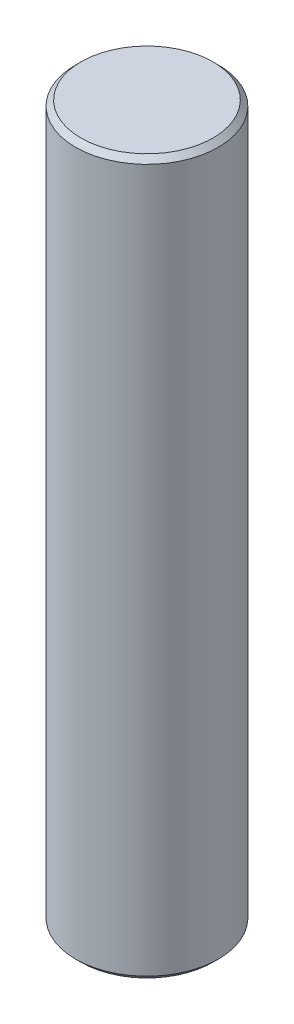
ISO-10303-21;
HEADER;
FILE_DESCRIPTION(('STEP AP214'),'2;1');
FILE_NAME('part.step','',(''),(''),'','','');
FILE_SCHEMA(('AUTOMOTIVE_DESIGN { 1 0 10303 214 1 1 1 1 }'));
ENDSEC;
DATA;
#1=APPLICATION_CONTEXT('core data for automotive mechanical design processes');
#2=APPLICATION_PROTOCOL_DEFINITION('international standard','automotive_design',2000,#1);
#3=PRODUCT_CONTEXT('',#1,'mechanical');
#4=PRODUCT('Part','Part','',(#3));
#5=PRODUCT_RELATED_PRODUCT_CATEGORY('part','',(#4));
#6=PRODUCT_DEFINITION_FORMATION('','',#4);
#7=PRODUCT_DEFINITION_CONTEXT('part definition',#1,'design');
#8=PRODUCT_DEFINITION('design','',#6,#7);
#9=PRODUCT_DEFINITION_SHAPE('','',#8);
#10=(LENGTH_UNIT() NAMED_UNIT(*) SI_UNIT(.MILLI.,.METRE.));
#11=(NAMED_UNIT(*) PLANE_ANGLE_UNIT() SI_UNIT($,.RADIAN.));
#12=(NAMED_UNIT(*) SI_UNIT($,.STERADIAN.) SOLID_ANGLE_UNIT());
#13=UNCERTAINTY_MEASURE_WITH_UNIT(LENGTH_MEASURE(1.E-05),#10,'distance_accuracy_value','');
#14=(GEOMETRIC_REPRESENTATION_CONTEXT(3) GLOBAL_UNCERTAINTY_ASSIGNED_CONTEXT((#13)) GLOBAL_UNIT_ASSIGNED_CONTEXT((#10,
#11,#12)) REPRESENTATION_CONTEXT('',''));
#15=CARTESIAN_POINT('',(0.,0.,0.));
#16=DIRECTION('',(0.,0.,1.));
#17=DIRECTION('',(1.,0.,0.));
#18=AXIS2_PLACEMENT_3D('',#15,#16,#17);
#19=CARTESIAN_POINT('',(0.,20.,0.));
#20=DIRECTION('',(0.,-1.,0.));
#21=DIRECTION('',(0.,0.,-1.));
#22=AXIS2_PLACEMENT_3D('',#19,#20,#21);
#23=CYLINDRICAL_SURFACE('',#22,2.);
#24=CARTESIAN_POINT('',(0.,0.149999999999994,0.));
#25=DIRECTION('',(0.,1.,0.));
#26=DIRECTION('',(0.,0.,1.));
#27=AXIS2_PLACEMENT_3D('',#24,#25,#26);
#28=CIRCLE('',#27,2.);
#29=CARTESIAN_POINT('',(0.,0.149999999999994,2.));
#30=VERTEX_POINT('',#29);
#31=EDGE_CURVE('E47',#30,#30,#28,.T.);
#32=ORIENTED_EDGE('',*,*,#31,.T.);
#33=EDGE_LOOP('',(#32));
#34=FACE_BOUND('',#33,.T.);
#35=CARTESIAN_POINT('',(0.,19.85,0.));
#36=DIRECTION('',(0.,1.,0.));
#37=DIRECTION('',(0.,0.,1.));
#38=AXIS2_PLACEMENT_3D('',#35,#36,#37);
#39=CIRCLE('',#38,2.);
#40=CARTESIAN_POINT('',(0.,19.85,2.));
#41=VERTEX_POINT('',#40);
#42=EDGE_CURVE('E51',#41,#41,#39,.F.);
#43=ORIENTED_EDGE('',*,*,#42,.T.);
#44=EDGE_LOOP('',(#43));
#45=FACE_BOUND('',#44,.T.);
#46=ADVANCED_FACE('F35',(#34,#45),#23,.T.);
#47=CARTESIAN_POINT('',(0.,20.,0.));
#48=DIRECTION('',(0.,1.,0.));
#49=DIRECTION('',(0.,0.,1.));
#50=AXIS2_PLACEMENT_3D('',#47,#48,#49);
#51=PLANE('',#50);
#52=CARTESIAN_POINT('',(0.,20.,0.));
#53=DIRECTION('',(0.,1.,0.));
#54=DIRECTION('',(0.,0.,1.));
#55=AXIS2_PLACEMENT_3D('',#52,#53,#54);
#56=CIRCLE('',#55,1.84999999999999);
#57=CARTESIAN_POINT('',(0.,20.,1.84999999999999));
#58=VERTEX_POINT('',#57);
#59=EDGE_CURVE('E11',#58,#58,#56,.T.);
#60=ORIENTED_EDGE('',*,*,#59,.T.);
#61=EDGE_LOOP('',(#60));
#62=FACE_BOUND('',#61,.T.);
#63=ADVANCED_FACE('F67',(#62),#51,.T.);
#64=CARTESIAN_POINT('',(0.,0.,0.));
#65=DIRECTION('',(0.,1.,0.));
#66=DIRECTION('',(0.,0.,1.));
#67=AXIS2_PLACEMENT_3D('',#64,#65,#66);
#68=PLANE('',#67);
#69=CARTESIAN_POINT('',(0.,0.,0.));
#70=DIRECTION('',(0.,1.,0.));
#71=DIRECTION('',(0.,0.,1.));
#72=AXIS2_PLACEMENT_3D('',#69,#70,#71);
#73=CIRCLE('',#72,1.85);
#74=CARTESIAN_POINT('',(0.,0.,1.85));
#75=VERTEX_POINT('',#74);
#76=EDGE_CURVE('E43',#75,#75,#73,.F.);
#77=ORIENTED_EDGE('',*,*,#76,.T.);
#78=EDGE_LOOP('',(#77));
#79=FACE_BOUND('',#78,.T.);
#80=ADVANCED_FACE('F64',(#79),#68,.F.);
#81=CARTESIAN_POINT('',(0.,0.149999999999994,0.));
#82=DIRECTION('',(0.,1.,0.));
#83=DIRECTION('',(0.,0.,1.));
#84=AXIS2_PLACEMENT_3D('',#81,#82,#83);
#85=CONICAL_SURFACE('',#84,2.,0.785398163397454);
#86=ORIENTED_EDGE('',*,*,#76,.F.);
#87=EDGE_LOOP('',(#86));
#88=FACE_BOUND('',#87,.T.);
#89=ORIENTED_EDGE('',*,*,#31,.F.);
#90=EDGE_LOOP('',(#89));
#91=FACE_BOUND('',#90,.T.);
#92=ADVANCED_FACE('F60',(#88,#91),#85,.T.);
#93=CARTESIAN_POINT('',(0.,20.,0.));
#94=DIRECTION('',(0.,-1.,0.));
#95=DIRECTION('',(0.,0.,-1.));
#96=AXIS2_PLACEMENT_3D('',#93,#94,#95);
#97=CONICAL_SURFACE('',#96,1.84999999999999,0.785398163397454);
#98=ORIENTED_EDGE('',*,*,#42,.F.);
#99=EDGE_LOOP('',(#98));
#100=FACE_BOUND('',#99,.T.);
#101=ORIENTED_EDGE('',*,*,#59,.F.);
#102=EDGE_LOOP('',(#101));
#103=FACE_BOUND('',#102,.T.);
#104=ADVANCED_FACE('F38',(#100,#103),#97,.T.);
#105=CLOSED_SHELL('',(#46,#63,#80,#92,#104));
#106=MANIFOLD_SOLID_BREP('B2',#105);
#107=ADVANCED_BREP_SHAPE_REPRESENTATION('',(#18,#106),#14);
#108=SHAPE_DEFINITION_REPRESENTATION(#9,#107);
ENDSEC;
END-ISO-10303-21;
